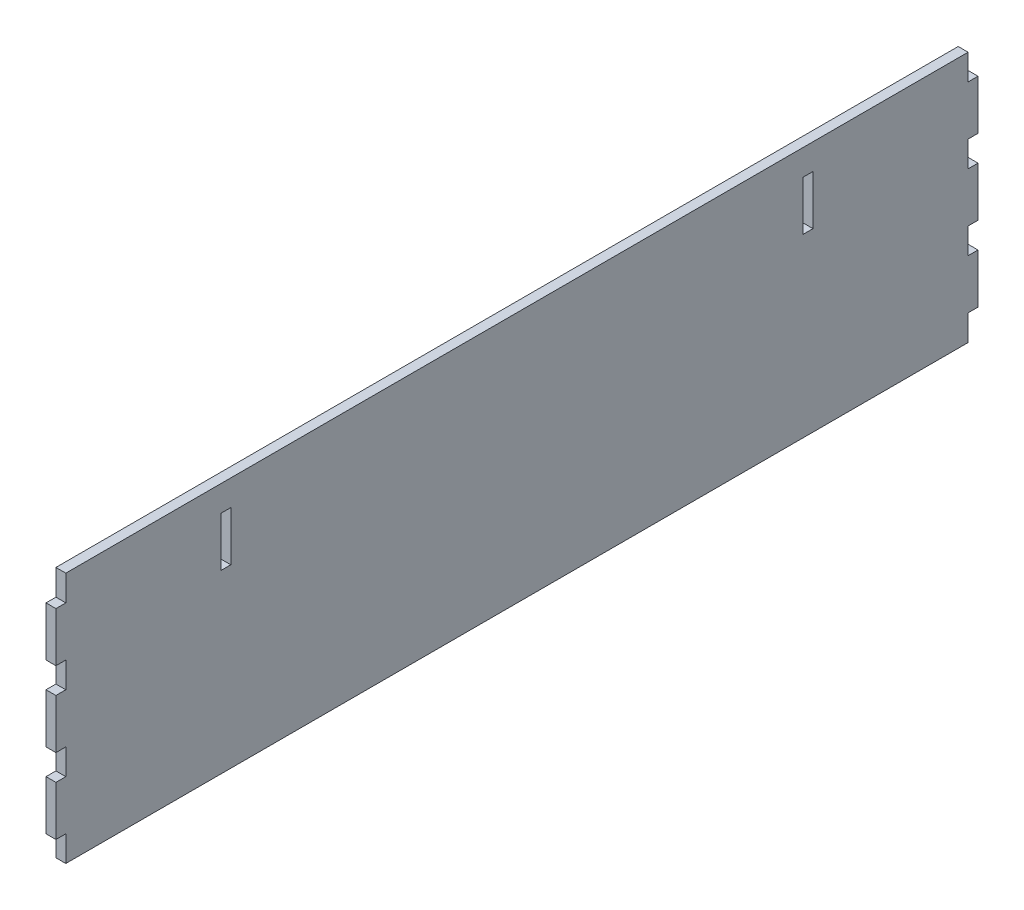
ISO-10303-21;
HEADER;
FILE_DESCRIPTION(('STEP AP214'),'2;1');
FILE_NAME('part.step','',(''),(''),'','','');
FILE_SCHEMA(('AUTOMOTIVE_DESIGN { 1 0 10303 214 1 1 1 1 }'));
ENDSEC;
DATA;
#1=APPLICATION_CONTEXT('core data for automotive mechanical design processes');
#2=APPLICATION_PROTOCOL_DEFINITION('international standard','automotive_design',2000,#1);
#3=PRODUCT_CONTEXT('',#1,'mechanical');
#4=PRODUCT('Part','Part','',(#3));
#5=PRODUCT_RELATED_PRODUCT_CATEGORY('part','',(#4));
#6=PRODUCT_DEFINITION_FORMATION('','',#4);
#7=PRODUCT_DEFINITION_CONTEXT('part definition',#1,'design');
#8=PRODUCT_DEFINITION('design','',#6,#7);
#9=PRODUCT_DEFINITION_SHAPE('','',#8);
#10=(LENGTH_UNIT() NAMED_UNIT(*) SI_UNIT(.MILLI.,.METRE.));
#11=(NAMED_UNIT(*) PLANE_ANGLE_UNIT() SI_UNIT($,.RADIAN.));
#12=(NAMED_UNIT(*) SI_UNIT($,.STERADIAN.) SOLID_ANGLE_UNIT());
#13=UNCERTAINTY_MEASURE_WITH_UNIT(LENGTH_MEASURE(1.E-05),#10,'distance_accuracy_value','');
#14=(GEOMETRIC_REPRESENTATION_CONTEXT(3) GLOBAL_UNCERTAINTY_ASSIGNED_CONTEXT((#13)) GLOBAL_UNIT_ASSIGNED_CONTEXT((#10,
#11,#12)) REPRESENTATION_CONTEXT('',''));
#15=CARTESIAN_POINT('',(0.,0.,0.));
#16=DIRECTION('',(0.,0.,1.));
#17=DIRECTION('',(1.,0.,0.));
#18=AXIS2_PLACEMENT_3D('',#15,#16,#17);
#19=CARTESIAN_POINT('',(-3.,0.,0.));
#20=DIRECTION('',(-1.,0.,0.));
#21=DIRECTION('',(0.,0.,1.));
#22=AXIS2_PLACEMENT_3D('',#19,#20,#21);
#23=PLANE('',#22);
#24=DIRECTION('',(0.,-1.,0.));
#25=VECTOR('',#24,1.);
#26=CARTESIAN_POINT('',(-3.,30.3,-89.7));
#27=LINE('',#26,#25);
#28=CARTESIAN_POINT('',(-3.,30.3,-89.7));
#29=VERTEX_POINT('',#28);
#30=CARTESIAN_POINT('',(-3.,15.3,-89.7));
#31=VERTEX_POINT('',#30);
#32=EDGE_CURVE('E289',#29,#31,#27,.T.);
#33=ORIENTED_EDGE('',*,*,#32,.F.);
#34=DIRECTION('',(0.,0.,-1.));
#35=VECTOR('',#34,1.);
#36=CARTESIAN_POINT('',(-3.,30.3,-89.7));
#37=LINE('',#36,#35);
#38=CARTESIAN_POINT('',(-3.,30.3,-86.7));
#39=VERTEX_POINT('',#38);
#40=EDGE_CURVE('E299',#39,#29,#37,.T.);
#41=ORIENTED_EDGE('',*,*,#40,.F.);
#42=DIRECTION('',(0.,1.,0.));
#43=VECTOR('',#42,1.);
#44=CARTESIAN_POINT('',(-3.,30.3,-86.7));
#45=LINE('',#44,#43);
#46=CARTESIAN_POINT('',(-3.,15.3,-86.7));
#47=VERTEX_POINT('',#46);
#48=EDGE_CURVE('E296',#47,#39,#45,.T.);
#49=ORIENTED_EDGE('',*,*,#48,.F.);
#50=DIRECTION('',(0.,0.,1.));
#51=VECTOR('',#50,1.);
#52=CARTESIAN_POINT('',(-3.,15.3,-89.7));
#53=LINE('',#52,#51);
#54=EDGE_CURVE('E293',#31,#47,#53,.T.);
#55=ORIENTED_EDGE('',*,*,#54,.F.);
#56=EDGE_LOOP('',(#33,#41,#49,#55));
#57=FACE_BOUND('',#56,.T.);
#58=DIRECTION('',(0.,-1.,0.));
#59=VECTOR('',#58,1.);
#60=CARTESIAN_POINT('',(-3.,38.1,139.7));
#61=LINE('',#60,#59);
#62=CARTESIAN_POINT('',(-3.,30.3,139.7));
#63=VERTEX_POINT('',#62);
#64=CARTESIAN_POINT('',(-3.,15.3,139.7));
#65=VERTEX_POINT('',#64);
#66=EDGE_CURVE('E502',#63,#65,#61,.T.);
#67=ORIENTED_EDGE('',*,*,#66,.F.);
#68=DIRECTION('',(0.,0.,-1.));
#69=VECTOR('',#68,1.);
#70=CARTESIAN_POINT('',(-3.,30.3,139.7));
#71=LINE('',#70,#69);
#72=CARTESIAN_POINT('',(-3.,30.3,136.7));
#73=VERTEX_POINT('',#72);
#74=EDGE_CURVE('E315',#63,#73,#71,.T.);
#75=ORIENTED_EDGE('',*,*,#74,.T.);
#76=DIRECTION('',(0.,1.,0.));
#77=VECTOR('',#76,1.);
#78=CARTESIAN_POINT('',(-3.,38.1,136.7));
#79=LINE('',#78,#77);
#80=CARTESIAN_POINT('',(-3.,38.1,136.7));
#81=VERTEX_POINT('',#80);
#82=EDGE_CURVE('E319',#73,#81,#79,.T.);
#83=ORIENTED_EDGE('',*,*,#82,.T.);
#84=DIRECTION('',(0.,0.,-1.));
#85=VECTOR('',#84,1.);
#86=CARTESIAN_POINT('',(-3.,38.1,139.7));
#87=LINE('',#86,#85);
#88=CARTESIAN_POINT('',(-3.,38.1,-136.7));
#89=VERTEX_POINT('',#88);
#90=EDGE_CURVE('E488',#81,#89,#87,.T.);
#91=ORIENTED_EDGE('',*,*,#90,.T.);
#92=DIRECTION('',(0.,1.,0.));
#93=VECTOR('',#92,1.);
#94=CARTESIAN_POINT('',(-3.,38.1,-136.7));
#95=LINE('',#94,#93);
#96=CARTESIAN_POINT('',(-3.,30.3,-136.7));
#97=VERTEX_POINT('',#96);
#98=EDGE_CURVE('E473',#97,#89,#95,.T.);
#99=ORIENTED_EDGE('',*,*,#98,.F.);
#100=DIRECTION('',(0.,0.,1.));
#101=VECTOR('',#100,1.);
#102=CARTESIAN_POINT('',(-3.,30.3,-139.7));
#103=LINE('',#102,#101);
#104=CARTESIAN_POINT('',(-3.,30.3,-139.7));
#105=VERTEX_POINT('',#104);
#106=EDGE_CURVE('E420',#105,#97,#103,.T.);
#107=ORIENTED_EDGE('',*,*,#106,.F.);
#108=DIRECTION('',(0.,-1.,0.));
#109=VECTOR('',#108,1.);
#110=CARTESIAN_POINT('',(-3.,38.1,-139.7));
#111=LINE('',#110,#109);
#112=CARTESIAN_POINT('',(-3.,15.3,-139.7));
#113=VERTEX_POINT('',#112);
#114=EDGE_CURVE('E492',#105,#113,#111,.T.);
#115=ORIENTED_EDGE('',*,*,#114,.T.);
#116=DIRECTION('',(0.,0.,-1.));
#117=VECTOR('',#116,1.);
#118=CARTESIAN_POINT('',(-3.,15.3,-139.7));
#119=LINE('',#118,#117);
#120=CARTESIAN_POINT('',(-3.,15.3,-136.7));
#121=VERTEX_POINT('',#120);
#122=EDGE_CURVE('E402',#121,#113,#119,.T.);
#123=ORIENTED_EDGE('',*,*,#122,.F.);
#124=DIRECTION('',(0.,1.,0.));
#125=VECTOR('',#124,1.);
#126=CARTESIAN_POINT('',(-3.,15.3,-136.7));
#127=LINE('',#126,#125);
#128=CARTESIAN_POINT('',(-3.,7.50000000000003,-136.7));
#129=VERTEX_POINT('',#128);
#130=EDGE_CURVE('E412',#129,#121,#127,.T.);
#131=ORIENTED_EDGE('',*,*,#130,.F.);
#132=DIRECTION('',(0.,0.,1.));
#133=VECTOR('',#132,1.);
#134=CARTESIAN_POINT('',(-3.,7.50000000000003,-139.7));
#135=LINE('',#134,#133);
#136=CARTESIAN_POINT('',(-3.,7.50000000000003,-139.7));
#137=VERTEX_POINT('',#136);
#138=EDGE_CURVE('E409',#137,#129,#135,.T.);
#139=ORIENTED_EDGE('',*,*,#138,.F.);
#140=CARTESIAN_POINT('',(-3.,-7.49999999999997,-139.7));
#141=VERTEX_POINT('',#140);
#142=EDGE_CURVE('E496',#137,#141,#111,.T.);
#143=ORIENTED_EDGE('',*,*,#142,.T.);
#144=DIRECTION('',(0.,0.,-1.));
#145=VECTOR('',#144,1.);
#146=CARTESIAN_POINT('',(-3.,-7.49999999999997,-139.7));
#147=LINE('',#146,#145);
#148=CARTESIAN_POINT('',(-3.,-7.49999999999997,-136.7));
#149=VERTEX_POINT('',#148);
#150=EDGE_CURVE('E430',#149,#141,#147,.T.);
#151=ORIENTED_EDGE('',*,*,#150,.F.);
#152=DIRECTION('',(0.,1.,0.));
#153=VECTOR('',#152,1.);
#154=CARTESIAN_POINT('',(-3.,-7.49999999999997,-136.7));
#155=LINE('',#154,#153);
#156=CARTESIAN_POINT('',(-3.,-15.3,-136.7));
#157=VERTEX_POINT('',#156);
#158=EDGE_CURVE('E440',#157,#149,#155,.T.);
#159=ORIENTED_EDGE('',*,*,#158,.F.);
#160=DIRECTION('',(0.,0.,1.));
#161=VECTOR('',#160,1.);
#162=CARTESIAN_POINT('',(-3.,-15.3,-139.7));
#163=LINE('',#162,#161);
#164=CARTESIAN_POINT('',(-3.,-15.3,-139.7));
#165=VERTEX_POINT('',#164);
#166=EDGE_CURVE('E437',#165,#157,#163,.T.);
#167=ORIENTED_EDGE('',*,*,#166,.F.);
#168=CARTESIAN_POINT('',(-3.,-30.3,-139.7));
#169=VERTEX_POINT('',#168);
#170=EDGE_CURVE('E490',#165,#169,#111,.T.);
#171=ORIENTED_EDGE('',*,*,#170,.T.);
#172=DIRECTION('',(0.,0.,-1.));
#173=VECTOR('',#172,1.);
#174=CARTESIAN_POINT('',(-3.,-30.3,-139.7));
#175=LINE('',#174,#173);
#176=CARTESIAN_POINT('',(-3.,-30.3,-136.7));
#177=VERTEX_POINT('',#176);
#178=EDGE_CURVE('E456',#177,#169,#175,.T.);
#179=ORIENTED_EDGE('',*,*,#178,.F.);
#180=DIRECTION('',(0.,1.,0.));
#181=VECTOR('',#180,1.);
#182=CARTESIAN_POINT('',(-3.,-30.3,-136.7));
#183=LINE('',#182,#181);
#184=CARTESIAN_POINT('',(-3.,-38.1,-136.7));
#185=VERTEX_POINT('',#184);
#186=EDGE_CURVE('E328',#185,#177,#183,.T.);
#187=ORIENTED_EDGE('',*,*,#186,.F.);
#188=DIRECTION('',(0.,0.,-1.));
#189=VECTOR('',#188,1.);
#190=CARTESIAN_POINT('',(-3.,-38.1,139.7));
#191=LINE('',#190,#189);
#192=CARTESIAN_POINT('',(-3.,-38.1,136.7));
#193=VERTEX_POINT('',#192);
#194=EDGE_CURVE('E495',#193,#185,#191,.T.);
#195=ORIENTED_EDGE('',*,*,#194,.F.);
#196=DIRECTION('',(0.,1.,0.));
#197=VECTOR('',#196,1.);
#198=CARTESIAN_POINT('',(-3.,-30.3,136.7));
#199=LINE('',#198,#197);
#200=CARTESIAN_POINT('',(-3.,-30.3,136.7));
#201=VERTEX_POINT('',#200);
#202=EDGE_CURVE('E385',#193,#201,#199,.T.);
#203=ORIENTED_EDGE('',*,*,#202,.T.);
#204=DIRECTION('',(0.,0.,1.));
#205=VECTOR('',#204,1.);
#206=CARTESIAN_POINT('',(-3.,-30.3,139.7));
#207=LINE('',#206,#205);
#208=CARTESIAN_POINT('',(-3.,-30.3,139.7));
#209=VERTEX_POINT('',#208);
#210=EDGE_CURVE('E305',#201,#209,#207,.T.);
#211=ORIENTED_EDGE('',*,*,#210,.T.);
#212=CARTESIAN_POINT('',(-3.,-15.3,139.7));
#213=VERTEX_POINT('',#212);
#214=EDGE_CURVE('E498',#213,#209,#61,.T.);
#215=ORIENTED_EDGE('',*,*,#214,.F.);
#216=DIRECTION('',(0.,0.,-1.));
#217=VECTOR('',#216,1.);
#218=CARTESIAN_POINT('',(-3.,-15.3,139.7));
#219=LINE('',#218,#217);
#220=CARTESIAN_POINT('',(-3.,-15.3,136.7));
#221=VERTEX_POINT('',#220);
#222=EDGE_CURVE('E360',#213,#221,#219,.T.);
#223=ORIENTED_EDGE('',*,*,#222,.T.);
#224=DIRECTION('',(0.,1.,0.));
#225=VECTOR('',#224,1.);
#226=CARTESIAN_POINT('',(-3.,-7.49999999999997,136.7));
#227=LINE('',#226,#225);
#228=CARTESIAN_POINT('',(-3.,-7.49999999999997,136.7));
#229=VERTEX_POINT('',#228);
#230=EDGE_CURVE('E369',#221,#229,#227,.T.);
#231=ORIENTED_EDGE('',*,*,#230,.T.);
#232=DIRECTION('',(0.,0.,1.));
#233=VECTOR('',#232,1.);
#234=CARTESIAN_POINT('',(-3.,-7.49999999999997,139.7));
#235=LINE('',#234,#233);
#236=CARTESIAN_POINT('',(-3.,-7.49999999999997,139.7));
#237=VERTEX_POINT('',#236);
#238=EDGE_CURVE('E366',#229,#237,#235,.T.);
#239=ORIENTED_EDGE('',*,*,#238,.T.);
#240=CARTESIAN_POINT('',(-3.,7.50000000000003,139.7));
#241=VERTEX_POINT('',#240);
#242=EDGE_CURVE('E501',#241,#237,#61,.T.);
#243=ORIENTED_EDGE('',*,*,#242,.F.);
#244=DIRECTION('',(0.,0.,-1.));
#245=VECTOR('',#244,1.);
#246=CARTESIAN_POINT('',(-3.,7.50000000000003,139.7));
#247=LINE('',#246,#245);
#248=CARTESIAN_POINT('',(-3.,7.50000000000003,136.7));
#249=VERTEX_POINT('',#248);
#250=EDGE_CURVE('E335',#241,#249,#247,.T.);
#251=ORIENTED_EDGE('',*,*,#250,.T.);
#252=DIRECTION('',(0.,1.,0.));
#253=VECTOR('',#252,1.);
#254=CARTESIAN_POINT('',(-3.,15.3,136.7));
#255=LINE('',#254,#253);
#256=CARTESIAN_POINT('',(-3.,15.3,136.7));
#257=VERTEX_POINT('',#256);
#258=EDGE_CURVE('E344',#249,#257,#255,.T.);
#259=ORIENTED_EDGE('',*,*,#258,.T.);
#260=DIRECTION('',(0.,0.,1.));
#261=VECTOR('',#260,1.);
#262=CARTESIAN_POINT('',(-3.,15.3,139.7));
#263=LINE('',#262,#261);
#264=EDGE_CURVE('E341',#257,#65,#263,.T.);
#265=ORIENTED_EDGE('',*,*,#264,.T.);
#266=EDGE_LOOP('',(#67,#75,#83,#91,#99,#107,#115,#123,#131,#139,#143,#151,#159,#167,#171,#179,
#187,#195,#203,#211,#215,#223,#231,#239,#243,#251,#259,#265));
#267=FACE_BOUND('',#266,.T.);
#268=DIRECTION('',(0.,0.,1.));
#269=VECTOR('',#268,1.);
#270=CARTESIAN_POINT('',(-3.,30.3,89.7));
#271=LINE('',#270,#269);
#272=CARTESIAN_POINT('',(-3.,30.3,86.7));
#273=VERTEX_POINT('',#272);
#274=CARTESIAN_POINT('',(-3.,30.3,89.7));
#275=VERTEX_POINT('',#274);
#276=EDGE_CURVE('E277',#273,#275,#271,.T.);
#277=ORIENTED_EDGE('',*,*,#276,.T.);
#278=DIRECTION('',(0.,-1.,0.));
#279=VECTOR('',#278,1.);
#280=CARTESIAN_POINT('',(-3.,30.3,89.7));
#281=LINE('',#280,#279);
#282=CARTESIAN_POINT('',(-3.,15.3,89.7));
#283=VERTEX_POINT('',#282);
#284=EDGE_CURVE('E48',#275,#283,#281,.T.);
#285=ORIENTED_EDGE('',*,*,#284,.T.);
#286=DIRECTION('',(0.,0.,-1.));
#287=VECTOR('',#286,1.);
#288=CARTESIAN_POINT('',(-3.,15.3,89.7));
#289=LINE('',#288,#287);
#290=CARTESIAN_POINT('',(-3.,15.3,86.7));
#291=VERTEX_POINT('',#290);
#292=EDGE_CURVE('E282',#283,#291,#289,.T.);
#293=ORIENTED_EDGE('',*,*,#292,.T.);
#294=DIRECTION('',(0.,1.,0.));
#295=VECTOR('',#294,1.);
#296=CARTESIAN_POINT('',(-3.,30.3,86.7));
#297=LINE('',#296,#295);
#298=EDGE_CURVE('E268',#291,#273,#297,.T.);
#299=ORIENTED_EDGE('',*,*,#298,.T.);
#300=EDGE_LOOP('',(#277,#285,#293,#299));
#301=FACE_BOUND('',#300,.T.);
#302=ADVANCED_FACE('F33',(#57,#267,#301),#23,.T.);
#303=CARTESIAN_POINT('',(0.,0.,0.));
#304=DIRECTION('',(-1.,0.,0.));
#305=DIRECTION('',(0.,0.,1.));
#306=AXIS2_PLACEMENT_3D('',#303,#304,#305);
#307=PLANE('',#306);
#308=DIRECTION('',(0.,0.,-1.));
#309=VECTOR('',#308,1.);
#310=CARTESIAN_POINT('',(0.,30.3,139.7));
#311=LINE('',#310,#309);
#312=CARTESIAN_POINT('',(0.,30.3,139.7));
#313=VERTEX_POINT('',#312);
#314=CARTESIAN_POINT('',(0.,30.3,136.7));
#315=VERTEX_POINT('',#314);
#316=EDGE_CURVE('E314',#313,#315,#311,.T.);
#317=ORIENTED_EDGE('',*,*,#316,.F.);
#318=DIRECTION('',(0.,-1.,0.));
#319=VECTOR('',#318,1.);
#320=CARTESIAN_POINT('',(0.,38.1,139.7));
#321=LINE('',#320,#319);
#322=CARTESIAN_POINT('',(0.,15.3,139.7));
#323=VERTEX_POINT('',#322);
#324=EDGE_CURVE('E491',#313,#323,#321,.T.);
#325=ORIENTED_EDGE('',*,*,#324,.T.);
#326=DIRECTION('',(0.,0.,1.));
#327=VECTOR('',#326,1.);
#328=CARTESIAN_POINT('',(0.,15.3,139.7));
#329=LINE('',#328,#327);
#330=CARTESIAN_POINT('',(0.,15.3,136.7));
#331=VERTEX_POINT('',#330);
#332=EDGE_CURVE('E332',#331,#323,#329,.T.);
#333=ORIENTED_EDGE('',*,*,#332,.F.);
#334=DIRECTION('',(0.,1.,0.));
#335=VECTOR('',#334,1.);
#336=CARTESIAN_POINT('',(0.,15.3,136.7));
#337=LINE('',#336,#335);
#338=CARTESIAN_POINT('',(0.,7.50000000000003,136.7));
#339=VERTEX_POINT('',#338);
#340=EDGE_CURVE('E334',#339,#331,#337,.T.);
#341=ORIENTED_EDGE('',*,*,#340,.F.);
#342=DIRECTION('',(0.,0.,-1.));
#343=VECTOR('',#342,1.);
#344=CARTESIAN_POINT('',(0.,7.50000000000003,139.7));
#345=LINE('',#344,#343);
#346=CARTESIAN_POINT('',(0.,7.50000000000003,139.7));
#347=VERTEX_POINT('',#346);
#348=EDGE_CURVE('E338',#347,#339,#345,.T.);
#349=ORIENTED_EDGE('',*,*,#348,.F.);
#350=CARTESIAN_POINT('',(0.,-7.49999999999997,139.7));
#351=VERTEX_POINT('',#350);
#352=EDGE_CURVE('E514',#347,#351,#321,.T.);
#353=ORIENTED_EDGE('',*,*,#352,.T.);
#354=DIRECTION('',(0.,0.,1.));
#355=VECTOR('',#354,1.);
#356=CARTESIAN_POINT('',(0.,-7.49999999999997,139.7));
#357=LINE('',#356,#355);
#358=CARTESIAN_POINT('',(0.,-7.49999999999997,136.7));
#359=VERTEX_POINT('',#358);
#360=EDGE_CURVE('E357',#359,#351,#357,.T.);
#361=ORIENTED_EDGE('',*,*,#360,.F.);
#362=DIRECTION('',(0.,1.,0.));
#363=VECTOR('',#362,1.);
#364=CARTESIAN_POINT('',(0.,-7.49999999999997,136.7));
#365=LINE('',#364,#363);
#366=CARTESIAN_POINT('',(0.,-15.3,136.7));
#367=VERTEX_POINT('',#366);
#368=EDGE_CURVE('E359',#367,#359,#365,.T.);
#369=ORIENTED_EDGE('',*,*,#368,.F.);
#370=DIRECTION('',(0.,0.,-1.));
#371=VECTOR('',#370,1.);
#372=CARTESIAN_POINT('',(0.,-15.3,139.7));
#373=LINE('',#372,#371);
#374=CARTESIAN_POINT('',(0.,-15.3,139.7));
#375=VERTEX_POINT('',#374);
#376=EDGE_CURVE('E363',#375,#367,#373,.T.);
#377=ORIENTED_EDGE('',*,*,#376,.F.);
#378=CARTESIAN_POINT('',(0.,-30.3,139.7));
#379=VERTEX_POINT('',#378);
#380=EDGE_CURVE('E511',#375,#379,#321,.T.);
#381=ORIENTED_EDGE('',*,*,#380,.T.);
#382=DIRECTION('',(0.,0.,1.));
#383=VECTOR('',#382,1.);
#384=CARTESIAN_POINT('',(0.,-30.3,139.7));
#385=LINE('',#384,#383);
#386=CARTESIAN_POINT('',(0.,-30.3,136.7));
#387=VERTEX_POINT('',#386);
#388=EDGE_CURVE('E382',#387,#379,#385,.T.);
#389=ORIENTED_EDGE('',*,*,#388,.F.);
#390=DIRECTION('',(0.,1.,0.));
#391=VECTOR('',#390,1.);
#392=CARTESIAN_POINT('',(0.,-30.3,136.7));
#393=LINE('',#392,#391);
#394=CARTESIAN_POINT('',(0.,-38.1,136.7));
#395=VERTEX_POINT('',#394);
#396=EDGE_CURVE('E384',#395,#387,#393,.T.);
#397=ORIENTED_EDGE('',*,*,#396,.F.);
#398=DIRECTION('',(0.,0.,-1.));
#399=VECTOR('',#398,1.);
#400=CARTESIAN_POINT('',(0.,-38.1,139.7));
#401=LINE('',#400,#399);
#402=CARTESIAN_POINT('',(0.,-38.1,-136.7));
#403=VERTEX_POINT('',#402);
#404=EDGE_CURVE('E508',#395,#403,#401,.T.);
#405=ORIENTED_EDGE('',*,*,#404,.T.);
#406=DIRECTION('',(0.,1.,0.));
#407=VECTOR('',#406,1.);
#408=CARTESIAN_POINT('',(0.,-30.3,-136.7));
#409=LINE('',#408,#407);
#410=CARTESIAN_POINT('',(0.,-30.3,-136.7));
#411=VERTEX_POINT('',#410);
#412=EDGE_CURVE('E452',#403,#411,#409,.T.);
#413=ORIENTED_EDGE('',*,*,#412,.T.);
#414=DIRECTION('',(0.,0.,-1.));
#415=VECTOR('',#414,1.);
#416=CARTESIAN_POINT('',(0.,-30.3,-139.7));
#417=LINE('',#416,#415);
#418=CARTESIAN_POINT('',(0.,-30.3,-139.7));
#419=VERTEX_POINT('',#418);
#420=EDGE_CURVE('E455',#411,#419,#417,.T.);
#421=ORIENTED_EDGE('',*,*,#420,.T.);
#422=DIRECTION('',(0.,-1.,0.));
#423=VECTOR('',#422,1.);
#424=CARTESIAN_POINT('',(0.,38.1,-139.7));
#425=LINE('',#424,#423);
#426=CARTESIAN_POINT('',(0.,-15.3,-139.7));
#427=VERTEX_POINT('',#426);
#428=EDGE_CURVE('E504',#427,#419,#425,.T.);
#429=ORIENTED_EDGE('',*,*,#428,.F.);
#430=DIRECTION('',(0.,0.,1.));
#431=VECTOR('',#430,1.);
#432=CARTESIAN_POINT('',(0.,-15.3,-139.7));
#433=LINE('',#432,#431);
#434=CARTESIAN_POINT('',(0.,-15.3,-136.7));
#435=VERTEX_POINT('',#434);
#436=EDGE_CURVE('E426',#427,#435,#433,.T.);
#437=ORIENTED_EDGE('',*,*,#436,.T.);
#438=DIRECTION('',(0.,1.,0.));
#439=VECTOR('',#438,1.);
#440=CARTESIAN_POINT('',(0.,-7.49999999999997,-136.7));
#441=LINE('',#440,#439);
#442=CARTESIAN_POINT('',(0.,-7.49999999999997,-136.7));
#443=VERTEX_POINT('',#442);
#444=EDGE_CURVE('E429',#435,#443,#441,.T.);
#445=ORIENTED_EDGE('',*,*,#444,.T.);
#446=DIRECTION('',(0.,0.,-1.));
#447=VECTOR('',#446,1.);
#448=CARTESIAN_POINT('',(0.,-7.49999999999997,-139.7));
#449=LINE('',#448,#447);
#450=CARTESIAN_POINT('',(0.,-7.49999999999997,-139.7));
#451=VERTEX_POINT('',#450);
#452=EDGE_CURVE('E433',#443,#451,#449,.T.);
#453=ORIENTED_EDGE('',*,*,#452,.T.);
#454=CARTESIAN_POINT('',(0.,7.50000000000003,-139.7));
#455=VERTEX_POINT('',#454);
#456=EDGE_CURVE('E509',#455,#451,#425,.T.);
#457=ORIENTED_EDGE('',*,*,#456,.F.);
#458=DIRECTION('',(0.,0.,1.));
#459=VECTOR('',#458,1.);
#460=CARTESIAN_POINT('',(0.,7.50000000000003,-139.7));
#461=LINE('',#460,#459);
#462=CARTESIAN_POINT('',(0.,7.50000000000003,-136.7));
#463=VERTEX_POINT('',#462);
#464=EDGE_CURVE('E398',#455,#463,#461,.T.);
#465=ORIENTED_EDGE('',*,*,#464,.T.);
#466=DIRECTION('',(0.,1.,0.));
#467=VECTOR('',#466,1.);
#468=CARTESIAN_POINT('',(0.,15.3,-136.7));
#469=LINE('',#468,#467);
#470=CARTESIAN_POINT('',(0.,15.3,-136.7));
#471=VERTEX_POINT('',#470);
#472=EDGE_CURVE('E401',#463,#471,#469,.T.);
#473=ORIENTED_EDGE('',*,*,#472,.T.);
#474=DIRECTION('',(0.,0.,-1.));
#475=VECTOR('',#474,1.);
#476=CARTESIAN_POINT('',(0.,15.3,-139.7));
#477=LINE('',#476,#475);
#478=CARTESIAN_POINT('',(0.,15.3,-139.7));
#479=VERTEX_POINT('',#478);
#480=EDGE_CURVE('E405',#471,#479,#477,.T.);
#481=ORIENTED_EDGE('',*,*,#480,.T.);
#482=CARTESIAN_POINT('',(0.,30.3,-139.7));
#483=VERTEX_POINT('',#482);
#484=EDGE_CURVE('E505',#483,#479,#425,.T.);
#485=ORIENTED_EDGE('',*,*,#484,.F.);
#486=DIRECTION('',(0.,0.,1.));
#487=VECTOR('',#486,1.);
#488=CARTESIAN_POINT('',(0.,30.3,-139.7));
#489=LINE('',#488,#487);
#490=CARTESIAN_POINT('',(0.,30.3,-136.7));
#491=VERTEX_POINT('',#490);
#492=EDGE_CURVE('E469',#483,#491,#489,.T.);
#493=ORIENTED_EDGE('',*,*,#492,.T.);
#494=DIRECTION('',(0.,1.,0.));
#495=VECTOR('',#494,1.);
#496=CARTESIAN_POINT('',(0.,38.1,-136.7));
#497=LINE('',#496,#495);
#498=CARTESIAN_POINT('',(0.,38.1,-136.7));
#499=VERTEX_POINT('',#498);
#500=EDGE_CURVE('E472',#491,#499,#497,.T.);
#501=ORIENTED_EDGE('',*,*,#500,.T.);
#502=DIRECTION('',(0.,0.,-1.));
#503=VECTOR('',#502,1.);
#504=CARTESIAN_POINT('',(0.,38.1,139.7));
#505=LINE('',#504,#503);
#506=CARTESIAN_POINT('',(0.,38.1,136.7));
#507=VERTEX_POINT('',#506);
#508=EDGE_CURVE('E484',#507,#499,#505,.T.);
#509=ORIENTED_EDGE('',*,*,#508,.F.);
#510=DIRECTION('',(0.,1.,0.));
#511=VECTOR('',#510,1.);
#512=CARTESIAN_POINT('',(0.,38.1,136.7));
#513=LINE('',#512,#511);
#514=EDGE_CURVE('E312',#315,#507,#513,.T.);
#515=ORIENTED_EDGE('',*,*,#514,.F.);
#516=EDGE_LOOP('',(#317,#325,#333,#341,#349,#353,#361,#369,#377,#381,#389,#397,#405,#413,#421,
#429,#437,#445,#453,#457,#465,#473,#481,#485,#493,#501,#509,#515));
#517=FACE_BOUND('',#516,.T.);
#518=DIRECTION('',(0.,0.,-1.));
#519=VECTOR('',#518,1.);
#520=CARTESIAN_POINT('',(0.,30.3,0.));
#521=LINE('',#520,#519);
#522=CARTESIAN_POINT('',(0.,30.3,-86.7));
#523=VERTEX_POINT('',#522);
#524=CARTESIAN_POINT('',(0.,30.3,-89.7));
#525=VERTEX_POINT('',#524);
#526=EDGE_CURVE('E521',#523,#525,#521,.T.);
#527=ORIENTED_EDGE('',*,*,#526,.T.);
#528=DIRECTION('',(0.,-1.,0.));
#529=VECTOR('',#528,1.);
#530=CARTESIAN_POINT('',(0.,0.,-89.7));
#531=LINE('',#530,#529);
#532=CARTESIAN_POINT('',(0.,15.3,-89.7));
#533=VERTEX_POINT('',#532);
#534=EDGE_CURVE('E524',#525,#533,#531,.T.);
#535=ORIENTED_EDGE('',*,*,#534,.T.);
#536=DIRECTION('',(0.,0.,1.));
#537=VECTOR('',#536,1.);
#538=CARTESIAN_POINT('',(0.,15.3,0.));
#539=LINE('',#538,#537);
#540=CARTESIAN_POINT('',(0.,15.3,-86.7));
#541=VERTEX_POINT('',#540);
#542=EDGE_CURVE('E515',#533,#541,#539,.T.);
#543=ORIENTED_EDGE('',*,*,#542,.T.);
#544=DIRECTION('',(0.,1.,0.));
#545=VECTOR('',#544,1.);
#546=CARTESIAN_POINT('',(0.,0.,-86.7));
#547=LINE('',#546,#545);
#548=EDGE_CURVE('E518',#541,#523,#547,.T.);
#549=ORIENTED_EDGE('',*,*,#548,.T.);
#550=EDGE_LOOP('',(#527,#535,#543,#549));
#551=FACE_BOUND('',#550,.T.);
#552=DIRECTION('',(0.,-1.,0.));
#553=VECTOR('',#552,1.);
#554=CARTESIAN_POINT('',(0.,0.,89.7));
#555=LINE('',#554,#553);
#556=CARTESIAN_POINT('',(0.,30.3,89.7));
#557=VERTEX_POINT('',#556);
#558=CARTESIAN_POINT('',(0.,15.3,89.7));
#559=VERTEX_POINT('',#558);
#560=EDGE_CURVE('E11',#557,#559,#555,.T.);
#561=ORIENTED_EDGE('',*,*,#560,.F.);
#562=DIRECTION('',(0.,0.,1.));
#563=VECTOR('',#562,1.);
#564=CARTESIAN_POINT('',(0.,30.3,0.));
#565=LINE('',#564,#563);
#566=CARTESIAN_POINT('',(0.,30.3,86.7));
#567=VERTEX_POINT('',#566);
#568=EDGE_CURVE('E527',#567,#557,#565,.T.);
#569=ORIENTED_EDGE('',*,*,#568,.F.);
#570=DIRECTION('',(0.,1.,0.));
#571=VECTOR('',#570,1.);
#572=CARTESIAN_POINT('',(0.,0.,86.7));
#573=LINE('',#572,#571);
#574=CARTESIAN_POINT('',(0.,15.3,86.7));
#575=VERTEX_POINT('',#574);
#576=EDGE_CURVE('E271',#575,#567,#573,.T.);
#577=ORIENTED_EDGE('',*,*,#576,.F.);
#578=DIRECTION('',(0.,0.,-1.));
#579=VECTOR('',#578,1.);
#580=CARTESIAN_POINT('',(0.,15.3,0.));
#581=LINE('',#580,#579);
#582=EDGE_CURVE('E41',#559,#575,#581,.T.);
#583=ORIENTED_EDGE('',*,*,#582,.F.);
#584=EDGE_LOOP('',(#561,#569,#577,#583));
#585=FACE_BOUND('',#584,.T.);
#586=ADVANCED_FACE('F535',(#517,#551,#585),#307,.F.);
#587=CARTESIAN_POINT('',(-3.,38.1,139.7));
#588=DIRECTION('',(0.,-1.,0.));
#589=DIRECTION('',(0.,0.,-1.));
#590=AXIS2_PLACEMENT_3D('',#587,#588,#589);
#591=PLANE('',#590);
#592=DIRECTION('',(-1.,0.,0.));
#593=VECTOR('',#592,1.);
#594=CARTESIAN_POINT('',(0.,38.1,136.7));
#595=LINE('',#594,#593);
#596=EDGE_CURVE('E318',#507,#81,#595,.T.);
#597=ORIENTED_EDGE('',*,*,#596,.F.);
#598=ORIENTED_EDGE('',*,*,#508,.T.);
#599=DIRECTION('',(-1.,0.,0.));
#600=VECTOR('',#599,1.);
#601=CARTESIAN_POINT('',(0.,38.1,-136.7));
#602=LINE('',#601,#600);
#603=EDGE_CURVE('E481',#499,#89,#602,.T.);
#604=ORIENTED_EDGE('',*,*,#603,.T.);
#605=ORIENTED_EDGE('',*,*,#90,.F.);
#606=EDGE_LOOP('',(#597,#598,#604,#605));
#607=FACE_BOUND('',#606,.T.);
#608=ADVANCED_FACE('F35',(#607),#591,.F.);
#609=CARTESIAN_POINT('',(-3.,-38.1,139.7));
#610=DIRECTION('',(0.,-1.,0.));
#611=DIRECTION('',(0.,0.,-1.));
#612=AXIS2_PLACEMENT_3D('',#609,#610,#611);
#613=PLANE('',#612);
#614=ORIENTED_EDGE('',*,*,#404,.F.);
#615=DIRECTION('',(-1.,0.,0.));
#616=VECTOR('',#615,1.);
#617=CARTESIAN_POINT('',(0.,-38.1,136.7));
#618=LINE('',#617,#616);
#619=EDGE_CURVE('E370',#395,#193,#618,.T.);
#620=ORIENTED_EDGE('',*,*,#619,.T.);
#621=ORIENTED_EDGE('',*,*,#194,.T.);
#622=DIRECTION('',(-1.,0.,0.));
#623=VECTOR('',#622,1.);
#624=CARTESIAN_POINT('',(0.,-38.1,-136.7));
#625=LINE('',#624,#623);
#626=EDGE_CURVE('E459',#403,#185,#625,.T.);
#627=ORIENTED_EDGE('',*,*,#626,.F.);
#628=EDGE_LOOP('',(#614,#620,#621,#627));
#629=FACE_BOUND('',#628,.T.);
#630=ADVANCED_FACE('F568',(#629),#613,.T.);
#631=CARTESIAN_POINT('',(-3.,38.1,139.7));
#632=DIRECTION('',(0.,0.,1.));
#633=DIRECTION('',(1.,0.,0.));
#634=AXIS2_PLACEMENT_3D('',#631,#632,#633);
#635=PLANE('',#634);
#636=ORIENTED_EDGE('',*,*,#324,.F.);
#637=DIRECTION('',(-1.,0.,0.));
#638=VECTOR('',#637,1.);
#639=CARTESIAN_POINT('',(0.,30.3,139.7));
#640=LINE('',#639,#638);
#641=EDGE_CURVE('E325',#313,#63,#640,.T.);
#642=ORIENTED_EDGE('',*,*,#641,.T.);
#643=ORIENTED_EDGE('',*,*,#66,.T.);
#644=DIRECTION('',(-1.,0.,0.));
#645=VECTOR('',#644,1.);
#646=CARTESIAN_POINT('',(0.,15.3,139.7));
#647=LINE('',#646,#645);
#648=EDGE_CURVE('E340',#323,#65,#647,.T.);
#649=ORIENTED_EDGE('',*,*,#648,.F.);
#650=EDGE_LOOP('',(#636,#642,#643,#649));
#651=FACE_BOUND('',#650,.T.);
#652=ADVANCED_FACE('F564',(#651),#635,.T.);
#653=ORIENTED_EDGE('',*,*,#352,.F.);
#654=DIRECTION('',(-1.,0.,0.));
#655=VECTOR('',#654,1.);
#656=CARTESIAN_POINT('',(0.,7.50000000000003,139.7));
#657=LINE('',#656,#655);
#658=EDGE_CURVE('E322',#347,#241,#657,.T.);
#659=ORIENTED_EDGE('',*,*,#658,.T.);
#660=ORIENTED_EDGE('',*,*,#242,.T.);
#661=DIRECTION('',(-1.,0.,0.));
#662=VECTOR('',#661,1.);
#663=CARTESIAN_POINT('',(0.,-7.49999999999997,139.7));
#664=LINE('',#663,#662);
#665=EDGE_CURVE('E365',#351,#237,#664,.T.);
#666=ORIENTED_EDGE('',*,*,#665,.F.);
#667=EDGE_LOOP('',(#653,#659,#660,#666));
#668=FACE_BOUND('',#667,.T.);
#669=ADVANCED_FACE('F567',(#668),#635,.T.);
#670=ORIENTED_EDGE('',*,*,#380,.F.);
#671=DIRECTION('',(-1.,0.,0.));
#672=VECTOR('',#671,1.);
#673=CARTESIAN_POINT('',(0.,-15.3,139.7));
#674=LINE('',#673,#672);
#675=EDGE_CURVE('E345',#375,#213,#674,.T.);
#676=ORIENTED_EDGE('',*,*,#675,.T.);
#677=ORIENTED_EDGE('',*,*,#214,.T.);
#678=DIRECTION('',(-1.,0.,0.));
#679=VECTOR('',#678,1.);
#680=CARTESIAN_POINT('',(0.,-30.3,139.7));
#681=LINE('',#680,#679);
#682=EDGE_CURVE('E388',#379,#209,#681,.T.);
#683=ORIENTED_EDGE('',*,*,#682,.F.);
#684=EDGE_LOOP('',(#670,#676,#677,#683));
#685=FACE_BOUND('',#684,.T.);
#686=ADVANCED_FACE('F570',(#685),#635,.T.);
#687=CARTESIAN_POINT('',(-3.,38.1,-139.7));
#688=DIRECTION('',(0.,0.,1.));
#689=DIRECTION('',(0.,-1.,0.));
#690=AXIS2_PLACEMENT_3D('',#687,#688,#689);
#691=PLANE('',#690);
#692=ORIENTED_EDGE('',*,*,#484,.T.);
#693=DIRECTION('',(-1.,0.,0.));
#694=VECTOR('',#693,1.);
#695=CARTESIAN_POINT('',(0.,15.3,-139.7));
#696=LINE('',#695,#694);
#697=EDGE_CURVE('E417',#479,#113,#696,.T.);
#698=ORIENTED_EDGE('',*,*,#697,.T.);
#699=ORIENTED_EDGE('',*,*,#114,.F.);
#700=DIRECTION('',(-1.,0.,0.));
#701=VECTOR('',#700,1.);
#702=CARTESIAN_POINT('',(0.,30.3,-139.7));
#703=LINE('',#702,#701);
#704=EDGE_CURVE('E476',#483,#105,#703,.T.);
#705=ORIENTED_EDGE('',*,*,#704,.F.);
#706=EDGE_LOOP('',(#692,#698,#699,#705));
#707=FACE_BOUND('',#706,.T.);
#708=ADVANCED_FACE('F578',(#707),#691,.F.);
#709=ORIENTED_EDGE('',*,*,#142,.F.);
#710=DIRECTION('',(-1.,0.,0.));
#711=VECTOR('',#710,1.);
#712=CARTESIAN_POINT('',(0.,7.50000000000003,-139.7));
#713=LINE('',#712,#711);
#714=EDGE_CURVE('E408',#455,#137,#713,.T.);
#715=ORIENTED_EDGE('',*,*,#714,.F.);
#716=ORIENTED_EDGE('',*,*,#456,.T.);
#717=DIRECTION('',(-1.,0.,0.));
#718=VECTOR('',#717,1.);
#719=CARTESIAN_POINT('',(0.,-7.49999999999997,-139.7));
#720=LINE('',#719,#718);
#721=EDGE_CURVE('E413',#451,#141,#720,.T.);
#722=ORIENTED_EDGE('',*,*,#721,.T.);
#723=EDGE_LOOP('',(#709,#715,#716,#722));
#724=FACE_BOUND('',#723,.T.);
#725=ADVANCED_FACE('F576',(#724),#691,.F.);
#726=ORIENTED_EDGE('',*,*,#170,.F.);
#727=DIRECTION('',(-1.,0.,0.));
#728=VECTOR('',#727,1.);
#729=CARTESIAN_POINT('',(0.,-15.3,-139.7));
#730=LINE('',#729,#728);
#731=EDGE_CURVE('E436',#427,#165,#730,.T.);
#732=ORIENTED_EDGE('',*,*,#731,.F.);
#733=ORIENTED_EDGE('',*,*,#428,.T.);
#734=DIRECTION('',(-1.,0.,0.));
#735=VECTOR('',#734,1.);
#736=CARTESIAN_POINT('',(0.,-30.3,-139.7));
#737=LINE('',#736,#735);
#738=EDGE_CURVE('E441',#419,#169,#737,.T.);
#739=ORIENTED_EDGE('',*,*,#738,.T.);
#740=EDGE_LOOP('',(#726,#732,#733,#739));
#741=FACE_BOUND('',#740,.T.);
#742=ADVANCED_FACE('F573',(#741),#691,.F.);
#743=CARTESIAN_POINT('',(0.,38.1,-136.7));
#744=DIRECTION('',(0.,0.,1.));
#745=DIRECTION('',(1.,0.,0.));
#746=AXIS2_PLACEMENT_3D('',#743,#744,#745);
#747=PLANE('',#746);
#748=ORIENTED_EDGE('',*,*,#98,.T.);
#749=ORIENTED_EDGE('',*,*,#603,.F.);
#750=ORIENTED_EDGE('',*,*,#500,.F.);
#751=DIRECTION('',(-1.,0.,0.));
#752=VECTOR('',#751,1.);
#753=CARTESIAN_POINT('',(0.,30.3,-136.7));
#754=LINE('',#753,#752);
#755=EDGE_CURVE('E485',#491,#97,#754,.T.);
#756=ORIENTED_EDGE('',*,*,#755,.T.);
#757=EDGE_LOOP('',(#748,#749,#750,#756));
#758=FACE_BOUND('',#757,.T.);
#759=ADVANCED_FACE('F575',(#758),#747,.F.);
#760=CARTESIAN_POINT('',(0.,30.3,-139.7));
#761=DIRECTION('',(0.,-1.,0.));
#762=DIRECTION('',(0.,0.,-1.));
#763=AXIS2_PLACEMENT_3D('',#760,#761,#762);
#764=PLANE('',#763);
#765=ORIENTED_EDGE('',*,*,#106,.T.);
#766=ORIENTED_EDGE('',*,*,#755,.F.);
#767=ORIENTED_EDGE('',*,*,#492,.F.);
#768=ORIENTED_EDGE('',*,*,#704,.T.);
#769=EDGE_LOOP('',(#765,#766,#767,#768));
#770=FACE_BOUND('',#769,.T.);
#771=ADVANCED_FACE('F561',(#770),#764,.F.);
#772=CARTESIAN_POINT('',(0.,-30.3,-139.7));
#773=DIRECTION('',(0.,1.,0.));
#774=DIRECTION('',(0.,0.,1.));
#775=AXIS2_PLACEMENT_3D('',#772,#773,#774);
#776=PLANE('',#775);
#777=ORIENTED_EDGE('',*,*,#178,.T.);
#778=ORIENTED_EDGE('',*,*,#738,.F.);
#779=ORIENTED_EDGE('',*,*,#420,.F.);
#780=DIRECTION('',(-1.,0.,0.));
#781=VECTOR('',#780,1.);
#782=CARTESIAN_POINT('',(0.,-30.3,-136.7));
#783=LINE('',#782,#781);
#784=EDGE_CURVE('E465',#411,#177,#783,.T.);
#785=ORIENTED_EDGE('',*,*,#784,.T.);
#786=EDGE_LOOP('',(#777,#778,#779,#785));
#787=FACE_BOUND('',#786,.T.);
#788=ADVANCED_FACE('F663',(#787),#776,.F.);
#789=CARTESIAN_POINT('',(0.,-30.3,-136.7));
#790=DIRECTION('',(0.,0.,1.));
#791=DIRECTION('',(1.,0.,0.));
#792=AXIS2_PLACEMENT_3D('',#789,#790,#791);
#793=PLANE('',#792);
#794=ORIENTED_EDGE('',*,*,#186,.T.);
#795=ORIENTED_EDGE('',*,*,#784,.F.);
#796=ORIENTED_EDGE('',*,*,#412,.F.);
#797=ORIENTED_EDGE('',*,*,#626,.T.);
#798=EDGE_LOOP('',(#794,#795,#796,#797));
#799=FACE_BOUND('',#798,.T.);
#800=ADVANCED_FACE('F660',(#799),#793,.F.);
#801=CARTESIAN_POINT('',(0.,-7.49999999999997,-139.7));
#802=DIRECTION('',(0.,1.,0.));
#803=DIRECTION('',(0.,0.,1.));
#804=AXIS2_PLACEMENT_3D('',#801,#802,#803);
#805=PLANE('',#804);
#806=ORIENTED_EDGE('',*,*,#150,.T.);
#807=ORIENTED_EDGE('',*,*,#721,.F.);
#808=ORIENTED_EDGE('',*,*,#452,.F.);
#809=DIRECTION('',(-1.,0.,0.));
#810=VECTOR('',#809,1.);
#811=CARTESIAN_POINT('',(0.,-7.49999999999997,-136.7));
#812=LINE('',#811,#810);
#813=EDGE_CURVE('E447',#443,#149,#812,.T.);
#814=ORIENTED_EDGE('',*,*,#813,.T.);
#815=EDGE_LOOP('',(#806,#807,#808,#814));
#816=FACE_BOUND('',#815,.T.);
#817=ADVANCED_FACE('F675',(#816),#805,.F.);
#818=CARTESIAN_POINT('',(0.,-7.49999999999997,-136.7));
#819=DIRECTION('',(0.,0.,1.));
#820=DIRECTION('',(1.,0.,0.));
#821=AXIS2_PLACEMENT_3D('',#818,#819,#820);
#822=PLANE('',#821);
#823=ORIENTED_EDGE('',*,*,#158,.T.);
#824=ORIENTED_EDGE('',*,*,#813,.F.);
#825=ORIENTED_EDGE('',*,*,#444,.F.);
#826=DIRECTION('',(-1.,0.,0.));
#827=VECTOR('',#826,1.);
#828=CARTESIAN_POINT('',(0.,-15.3,-136.7));
#829=LINE('',#828,#827);
#830=EDGE_CURVE('E449',#435,#157,#829,.T.);
#831=ORIENTED_EDGE('',*,*,#830,.T.);
#832=EDGE_LOOP('',(#823,#824,#825,#831));
#833=FACE_BOUND('',#832,.T.);
#834=ADVANCED_FACE('F683',(#833),#822,.F.);
#835=CARTESIAN_POINT('',(0.,-15.3,-139.7));
#836=DIRECTION('',(0.,-1.,0.));
#837=DIRECTION('',(0.,0.,-1.));
#838=AXIS2_PLACEMENT_3D('',#835,#836,#837);
#839=PLANE('',#838);
#840=ORIENTED_EDGE('',*,*,#166,.T.);
#841=ORIENTED_EDGE('',*,*,#830,.F.);
#842=ORIENTED_EDGE('',*,*,#436,.F.);
#843=ORIENTED_EDGE('',*,*,#731,.T.);
#844=EDGE_LOOP('',(#840,#841,#842,#843));
#845=FACE_BOUND('',#844,.T.);
#846=ADVANCED_FACE('F681',(#845),#839,.F.);
#847=CARTESIAN_POINT('',(0.,15.3,-139.7));
#848=DIRECTION('',(0.,1.,0.));
#849=DIRECTION('',(0.,0.,1.));
#850=AXIS2_PLACEMENT_3D('',#847,#848,#849);
#851=PLANE('',#850);
#852=ORIENTED_EDGE('',*,*,#122,.T.);
#853=ORIENTED_EDGE('',*,*,#697,.F.);
#854=ORIENTED_EDGE('',*,*,#480,.F.);
#855=DIRECTION('',(-1.,0.,0.));
#856=VECTOR('',#855,1.);
#857=CARTESIAN_POINT('',(0.,15.3,-136.7));
#858=LINE('',#857,#856);
#859=EDGE_CURVE('E421',#471,#121,#858,.T.);
#860=ORIENTED_EDGE('',*,*,#859,.T.);
#861=EDGE_LOOP('',(#852,#853,#854,#860));
#862=FACE_BOUND('',#861,.T.);
#863=ADVANCED_FACE('F599',(#862),#851,.F.);
#864=CARTESIAN_POINT('',(0.,15.3,-136.7));
#865=DIRECTION('',(0.,0.,1.));
#866=DIRECTION('',(1.,0.,0.));
#867=AXIS2_PLACEMENT_3D('',#864,#865,#866);
#868=PLANE('',#867);
#869=ORIENTED_EDGE('',*,*,#130,.T.);
#870=ORIENTED_EDGE('',*,*,#859,.F.);
#871=ORIENTED_EDGE('',*,*,#472,.F.);
#872=DIRECTION('',(-1.,0.,0.));
#873=VECTOR('',#872,1.);
#874=CARTESIAN_POINT('',(0.,7.50000000000003,-136.7));
#875=LINE('',#874,#873);
#876=EDGE_CURVE('E423',#463,#129,#875,.T.);
#877=ORIENTED_EDGE('',*,*,#876,.T.);
#878=EDGE_LOOP('',(#869,#870,#871,#877));
#879=FACE_BOUND('',#878,.T.);
#880=ADVANCED_FACE('F725',(#879),#868,.F.);
#881=CARTESIAN_POINT('',(0.,7.50000000000003,-139.7));
#882=DIRECTION('',(0.,-1.,0.));
#883=DIRECTION('',(0.,0.,-1.));
#884=AXIS2_PLACEMENT_3D('',#881,#882,#883);
#885=PLANE('',#884);
#886=ORIENTED_EDGE('',*,*,#138,.T.);
#887=ORIENTED_EDGE('',*,*,#876,.F.);
#888=ORIENTED_EDGE('',*,*,#464,.F.);
#889=ORIENTED_EDGE('',*,*,#714,.T.);
#890=EDGE_LOOP('',(#886,#887,#888,#889));
#891=FACE_BOUND('',#890,.T.);
#892=ADVANCED_FACE('F734',(#891),#885,.F.);
#893=CARTESIAN_POINT('',(0.,-30.3,136.7));
#894=DIRECTION('',(0.,0.,1.));
#895=DIRECTION('',(1.,0.,0.));
#896=AXIS2_PLACEMENT_3D('',#893,#894,#895);
#897=PLANE('',#896);
#898=ORIENTED_EDGE('',*,*,#202,.F.);
#899=ORIENTED_EDGE('',*,*,#619,.F.);
#900=ORIENTED_EDGE('',*,*,#396,.T.);
#901=DIRECTION('',(-1.,0.,0.));
#902=VECTOR('',#901,1.);
#903=CARTESIAN_POINT('',(0.,-30.3,136.7));
#904=LINE('',#903,#902);
#905=EDGE_CURVE('E395',#387,#201,#904,.T.);
#906=ORIENTED_EDGE('',*,*,#905,.T.);
#907=EDGE_LOOP('',(#898,#899,#900,#906));
#908=FACE_BOUND('',#907,.T.);
#909=ADVANCED_FACE('F653',(#908),#897,.T.);
#910=CARTESIAN_POINT('',(0.,-30.3,139.7));
#911=DIRECTION('',(0.,-1.,0.));
#912=DIRECTION('',(0.,0.,-1.));
#913=AXIS2_PLACEMENT_3D('',#910,#911,#912);
#914=PLANE('',#913);
#915=ORIENTED_EDGE('',*,*,#210,.F.);
#916=ORIENTED_EDGE('',*,*,#905,.F.);
#917=ORIENTED_EDGE('',*,*,#388,.T.);
#918=ORIENTED_EDGE('',*,*,#682,.T.);
#919=EDGE_LOOP('',(#915,#916,#917,#918));
#920=FACE_BOUND('',#919,.T.);
#921=ADVANCED_FACE('F649',(#920),#914,.T.);
#922=CARTESIAN_POINT('',(0.,-15.3,139.7));
#923=DIRECTION('',(0.,1.,0.));
#924=DIRECTION('',(0.,0.,1.));
#925=AXIS2_PLACEMENT_3D('',#922,#923,#924);
#926=PLANE('',#925);
#927=ORIENTED_EDGE('',*,*,#222,.F.);
#928=ORIENTED_EDGE('',*,*,#675,.F.);
#929=ORIENTED_EDGE('',*,*,#376,.T.);
#930=DIRECTION('',(-1.,0.,0.));
#931=VECTOR('',#930,1.);
#932=CARTESIAN_POINT('',(0.,-15.3,136.7));
#933=LINE('',#932,#931);
#934=EDGE_CURVE('E377',#367,#221,#933,.T.);
#935=ORIENTED_EDGE('',*,*,#934,.T.);
#936=EDGE_LOOP('',(#927,#928,#929,#935));
#937=FACE_BOUND('',#936,.T.);
#938=ADVANCED_FACE('F792',(#937),#926,.T.);
#939=CARTESIAN_POINT('',(0.,-7.49999999999997,136.7));
#940=DIRECTION('',(0.,0.,1.));
#941=DIRECTION('',(1.,0.,0.));
#942=AXIS2_PLACEMENT_3D('',#939,#940,#941);
#943=PLANE('',#942);
#944=ORIENTED_EDGE('',*,*,#230,.F.);
#945=ORIENTED_EDGE('',*,*,#934,.F.);
#946=ORIENTED_EDGE('',*,*,#368,.T.);
#947=DIRECTION('',(-1.,0.,0.));
#948=VECTOR('',#947,1.);
#949=CARTESIAN_POINT('',(0.,-7.49999999999997,136.7));
#950=LINE('',#949,#948);
#951=EDGE_CURVE('E379',#359,#229,#950,.T.);
#952=ORIENTED_EDGE('',*,*,#951,.T.);
#953=EDGE_LOOP('',(#944,#945,#946,#952));
#954=FACE_BOUND('',#953,.T.);
#955=ADVANCED_FACE('F641',(#954),#943,.T.);
#956=CARTESIAN_POINT('',(0.,-7.49999999999997,139.7));
#957=DIRECTION('',(0.,-1.,0.));
#958=DIRECTION('',(0.,0.,-1.));
#959=AXIS2_PLACEMENT_3D('',#956,#957,#958);
#960=PLANE('',#959);
#961=ORIENTED_EDGE('',*,*,#238,.F.);
#962=ORIENTED_EDGE('',*,*,#951,.F.);
#963=ORIENTED_EDGE('',*,*,#360,.T.);
#964=ORIENTED_EDGE('',*,*,#665,.T.);
#965=EDGE_LOOP('',(#961,#962,#963,#964));
#966=FACE_BOUND('',#965,.T.);
#967=ADVANCED_FACE('F636',(#966),#960,.T.);
#968=CARTESIAN_POINT('',(0.,7.50000000000003,139.7));
#969=DIRECTION('',(0.,1.,0.));
#970=DIRECTION('',(0.,0.,1.));
#971=AXIS2_PLACEMENT_3D('',#968,#969,#970);
#972=PLANE('',#971);
#973=ORIENTED_EDGE('',*,*,#250,.F.);
#974=ORIENTED_EDGE('',*,*,#658,.F.);
#975=ORIENTED_EDGE('',*,*,#348,.T.);
#976=DIRECTION('',(-1.,0.,0.));
#977=VECTOR('',#976,1.);
#978=CARTESIAN_POINT('',(0.,7.50000000000003,136.7));
#979=LINE('',#978,#977);
#980=EDGE_CURVE('E352',#339,#249,#979,.T.);
#981=ORIENTED_EDGE('',*,*,#980,.T.);
#982=EDGE_LOOP('',(#973,#974,#975,#981));
#983=FACE_BOUND('',#982,.T.);
#984=ADVANCED_FACE('F817',(#983),#972,.T.);
#985=CARTESIAN_POINT('',(0.,15.3,136.7));
#986=DIRECTION('',(0.,0.,1.));
#987=DIRECTION('',(1.,0.,0.));
#988=AXIS2_PLACEMENT_3D('',#985,#986,#987);
#989=PLANE('',#988);
#990=ORIENTED_EDGE('',*,*,#258,.F.);
#991=ORIENTED_EDGE('',*,*,#980,.F.);
#992=ORIENTED_EDGE('',*,*,#340,.T.);
#993=DIRECTION('',(-1.,0.,0.));
#994=VECTOR('',#993,1.);
#995=CARTESIAN_POINT('',(0.,15.3,136.7));
#996=LINE('',#995,#994);
#997=EDGE_CURVE('E354',#331,#257,#996,.T.);
#998=ORIENTED_EDGE('',*,*,#997,.T.);
#999=EDGE_LOOP('',(#990,#991,#992,#998));
#1000=FACE_BOUND('',#999,.T.);
#1001=ADVANCED_FACE('F826',(#1000),#989,.T.);
#1002=CARTESIAN_POINT('',(0.,15.3,139.7));
#1003=DIRECTION('',(0.,-1.,0.));
#1004=DIRECTION('',(0.,0.,-1.));
#1005=AXIS2_PLACEMENT_3D('',#1002,#1003,#1004);
#1006=PLANE('',#1005);
#1007=ORIENTED_EDGE('',*,*,#264,.F.);
#1008=ORIENTED_EDGE('',*,*,#997,.F.);
#1009=ORIENTED_EDGE('',*,*,#332,.T.);
#1010=ORIENTED_EDGE('',*,*,#648,.T.);
#1011=EDGE_LOOP('',(#1007,#1008,#1009,#1010));
#1012=FACE_BOUND('',#1011,.T.);
#1013=ADVANCED_FACE('F836',(#1012),#1006,.T.);
#1014=CARTESIAN_POINT('',(0.,30.3,139.7));
#1015=DIRECTION('',(0.,1.,0.));
#1016=DIRECTION('',(0.,0.,1.));
#1017=AXIS2_PLACEMENT_3D('',#1014,#1015,#1016);
#1018=PLANE('',#1017);
#1019=ORIENTED_EDGE('',*,*,#74,.F.);
#1020=ORIENTED_EDGE('',*,*,#641,.F.);
#1021=ORIENTED_EDGE('',*,*,#316,.T.);
#1022=DIRECTION('',(-1.,0.,0.));
#1023=VECTOR('',#1022,1.);
#1024=CARTESIAN_POINT('',(0.,30.3,136.7));
#1025=LINE('',#1024,#1023);
#1026=EDGE_CURVE('E329',#315,#73,#1025,.T.);
#1027=ORIENTED_EDGE('',*,*,#1026,.T.);
#1028=EDGE_LOOP('',(#1019,#1020,#1021,#1027));
#1029=FACE_BOUND('',#1028,.T.);
#1030=ADVANCED_FACE('F619',(#1029),#1018,.T.);
#1031=CARTESIAN_POINT('',(0.,38.1,136.7));
#1032=DIRECTION('',(0.,0.,1.));
#1033=DIRECTION('',(1.,0.,0.));
#1034=AXIS2_PLACEMENT_3D('',#1031,#1032,#1033);
#1035=PLANE('',#1034);
#1036=ORIENTED_EDGE('',*,*,#82,.F.);
#1037=ORIENTED_EDGE('',*,*,#1026,.F.);
#1038=ORIENTED_EDGE('',*,*,#514,.T.);
#1039=ORIENTED_EDGE('',*,*,#596,.T.);
#1040=EDGE_LOOP('',(#1036,#1037,#1038,#1039));
#1041=FACE_BOUND('',#1040,.T.);
#1042=ADVANCED_FACE('F616',(#1041),#1035,.T.);
#1043=CARTESIAN_POINT('',(7.,30.3,-89.7));
#1044=DIRECTION('',(0.,0.,-1.));
#1045=DIRECTION('',(-1.,0.,0.));
#1046=AXIS2_PLACEMENT_3D('',#1043,#1044,#1045);
#1047=PLANE('',#1046);
#1048=DIRECTION('',(-1.,0.,0.));
#1049=VECTOR('',#1048,1.);
#1050=CARTESIAN_POINT('',(7.,30.3,-89.7));
#1051=LINE('',#1050,#1049);
#1052=EDGE_CURVE('E303',#525,#29,#1051,.T.);
#1053=ORIENTED_EDGE('',*,*,#1052,.T.);
#1054=ORIENTED_EDGE('',*,*,#32,.T.);
#1055=DIRECTION('',(-1.,0.,0.));
#1056=VECTOR('',#1055,1.);
#1057=CARTESIAN_POINT('',(7.,15.3,-89.7));
#1058=LINE('',#1057,#1056);
#1059=EDGE_CURVE('E302',#533,#31,#1058,.T.);
#1060=ORIENTED_EDGE('',*,*,#1059,.F.);
#1061=ORIENTED_EDGE('',*,*,#534,.F.);
#1062=EDGE_LOOP('',(#1053,#1054,#1060,#1061));
#1063=FACE_BOUND('',#1062,.T.);
#1064=ADVANCED_FACE('F863',(#1063),#1047,.F.);
#1065=CARTESIAN_POINT('',(7.,30.3,-89.7));
#1066=DIRECTION('',(0.,1.,0.));
#1067=DIRECTION('',(0.,0.,1.));
#1068=AXIS2_PLACEMENT_3D('',#1065,#1066,#1067);
#1069=PLANE('',#1068);
#1070=DIRECTION('',(-1.,0.,0.));
#1071=VECTOR('',#1070,1.);
#1072=CARTESIAN_POINT('',(7.,30.3,-86.7));
#1073=LINE('',#1072,#1071);
#1074=EDGE_CURVE('E306',#523,#39,#1073,.T.);
#1075=ORIENTED_EDGE('',*,*,#1074,.T.);
#1076=ORIENTED_EDGE('',*,*,#40,.T.);
#1077=ORIENTED_EDGE('',*,*,#1052,.F.);
#1078=ORIENTED_EDGE('',*,*,#526,.F.);
#1079=EDGE_LOOP('',(#1075,#1076,#1077,#1078));
#1080=FACE_BOUND('',#1079,.T.);
#1081=ADVANCED_FACE('F872',(#1080),#1069,.F.);
#1082=CARTESIAN_POINT('',(7.,30.3,-86.7));
#1083=DIRECTION('',(0.,0.,1.));
#1084=DIRECTION('',(1.,0.,0.));
#1085=AXIS2_PLACEMENT_3D('',#1082,#1083,#1084);
#1086=PLANE('',#1085);
#1087=DIRECTION('',(-1.,0.,0.));
#1088=VECTOR('',#1087,1.);
#1089=CARTESIAN_POINT('',(7.,15.3,-86.7));
#1090=LINE('',#1089,#1088);
#1091=EDGE_CURVE('E308',#541,#47,#1090,.T.);
#1092=ORIENTED_EDGE('',*,*,#1091,.T.);
#1093=ORIENTED_EDGE('',*,*,#48,.T.);
#1094=ORIENTED_EDGE('',*,*,#1074,.F.);
#1095=ORIENTED_EDGE('',*,*,#548,.F.);
#1096=EDGE_LOOP('',(#1092,#1093,#1094,#1095));
#1097=FACE_BOUND('',#1096,.T.);
#1098=ADVANCED_FACE('F545',(#1097),#1086,.F.);
#1099=CARTESIAN_POINT('',(7.,15.3,-89.7));
#1100=DIRECTION('',(0.,-1.,0.));
#1101=DIRECTION('',(0.,0.,-1.));
#1102=AXIS2_PLACEMENT_3D('',#1099,#1100,#1101);
#1103=PLANE('',#1102);
#1104=ORIENTED_EDGE('',*,*,#1059,.T.);
#1105=ORIENTED_EDGE('',*,*,#54,.T.);
#1106=ORIENTED_EDGE('',*,*,#1091,.F.);
#1107=ORIENTED_EDGE('',*,*,#542,.F.);
#1108=EDGE_LOOP('',(#1104,#1105,#1106,#1107));
#1109=FACE_BOUND('',#1108,.T.);
#1110=ADVANCED_FACE('F538',(#1109),#1103,.F.);
#1111=CARTESIAN_POINT('',(7.,30.3,89.7));
#1112=DIRECTION('',(0.,0.,-1.));
#1113=DIRECTION('',(-1.,0.,0.));
#1114=AXIS2_PLACEMENT_3D('',#1111,#1112,#1113);
#1115=PLANE('',#1114);
#1116=ORIENTED_EDGE('',*,*,#560,.T.);
#1117=DIRECTION('',(-1.,0.,0.));
#1118=VECTOR('',#1117,1.);
#1119=CARTESIAN_POINT('',(7.,15.3,89.7));
#1120=LINE('',#1119,#1118);
#1121=EDGE_CURVE('E287',#559,#283,#1120,.T.);
#1122=ORIENTED_EDGE('',*,*,#1121,.T.);
#1123=ORIENTED_EDGE('',*,*,#284,.F.);
#1124=DIRECTION('',(-1.,0.,0.));
#1125=VECTOR('',#1124,1.);
#1126=CARTESIAN_POINT('',(7.,30.3,89.7));
#1127=LINE('',#1126,#1125);
#1128=EDGE_CURVE('E274',#557,#275,#1127,.T.);
#1129=ORIENTED_EDGE('',*,*,#1128,.F.);
#1130=EDGE_LOOP('',(#1116,#1122,#1123,#1129));
#1131=FACE_BOUND('',#1130,.T.);
#1132=ADVANCED_FACE('F536',(#1131),#1115,.T.);
#1133=CARTESIAN_POINT('',(7.,15.3,89.7));
#1134=DIRECTION('',(0.,1.,0.));
#1135=DIRECTION('',(0.,0.,1.));
#1136=AXIS2_PLACEMENT_3D('',#1133,#1134,#1135);
#1137=PLANE('',#1136);
#1138=ORIENTED_EDGE('',*,*,#582,.T.);
#1139=DIRECTION('',(-1.,0.,0.));
#1140=VECTOR('',#1139,1.);
#1141=CARTESIAN_POINT('',(7.,15.3,86.7));
#1142=LINE('',#1141,#1140);
#1143=EDGE_CURVE('E273',#575,#291,#1142,.T.);
#1144=ORIENTED_EDGE('',*,*,#1143,.T.);
#1145=ORIENTED_EDGE('',*,*,#292,.F.);
#1146=ORIENTED_EDGE('',*,*,#1121,.F.);
#1147=EDGE_LOOP('',(#1138,#1144,#1145,#1146));
#1148=FACE_BOUND('',#1147,.T.);
#1149=ADVANCED_FACE('F532',(#1148),#1137,.T.);
#1150=CARTESIAN_POINT('',(7.,30.3,86.7));
#1151=DIRECTION('',(0.,0.,1.));
#1152=DIRECTION('',(1.,0.,0.));
#1153=AXIS2_PLACEMENT_3D('',#1150,#1151,#1152);
#1154=PLANE('',#1153);
#1155=ORIENTED_EDGE('',*,*,#576,.T.);
#1156=DIRECTION('',(-1.,0.,0.));
#1157=VECTOR('',#1156,1.);
#1158=CARTESIAN_POINT('',(7.,30.3,86.7));
#1159=LINE('',#1158,#1157);
#1160=EDGE_CURVE('E56',#567,#273,#1159,.T.);
#1161=ORIENTED_EDGE('',*,*,#1160,.T.);
#1162=ORIENTED_EDGE('',*,*,#298,.F.);
#1163=ORIENTED_EDGE('',*,*,#1143,.F.);
#1164=EDGE_LOOP('',(#1155,#1161,#1162,#1163));
#1165=FACE_BOUND('',#1164,.T.);
#1166=ADVANCED_FACE('F265',(#1165),#1154,.T.);
#1167=CARTESIAN_POINT('',(7.,30.3,89.7));
#1168=DIRECTION('',(0.,-1.,0.));
#1169=DIRECTION('',(0.,0.,-1.));
#1170=AXIS2_PLACEMENT_3D('',#1167,#1168,#1169);
#1171=PLANE('',#1170);
#1172=ORIENTED_EDGE('',*,*,#568,.T.);
#1173=ORIENTED_EDGE('',*,*,#1128,.T.);
#1174=ORIENTED_EDGE('',*,*,#276,.F.);
#1175=ORIENTED_EDGE('',*,*,#1160,.F.);
#1176=EDGE_LOOP('',(#1172,#1173,#1174,#1175));
#1177=FACE_BOUND('',#1176,.T.);
#1178=ADVANCED_FACE('F278',(#1177),#1171,.T.);
#1179=CLOSED_SHELL('',(#302,#586,#608,#630,#652,#669,#686,#708,#725,#742,#759,#771,#788,#800,
#817,#834,#846,#863,#880,#892,#909,#921,#938,#955,#967,#984,#1001,#1013,#1030,#1042,#1064,#1081,
#1098,#1110,#1132,#1149,#1166,#1178));
#1180=MANIFOLD_SOLID_BREP('B2',#1179);
#1181=ADVANCED_BREP_SHAPE_REPRESENTATION('',(#18,#1180),#14);
#1182=SHAPE_DEFINITION_REPRESENTATION(#9,#1181);
ENDSEC;
END-ISO-10303-21;
